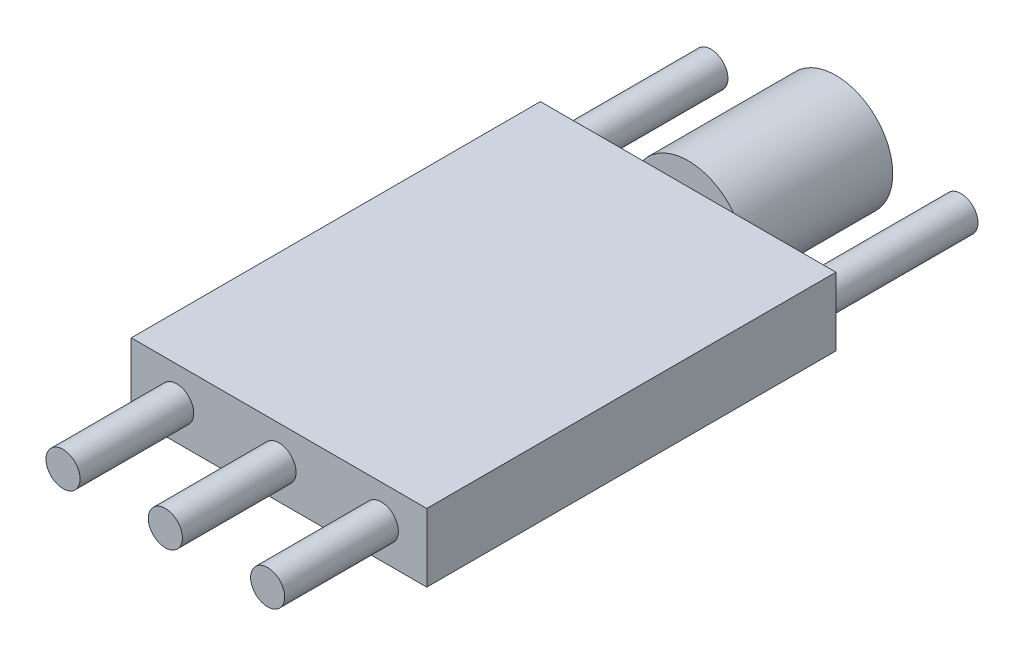
ISO-10303-21;
HEADER;
FILE_DESCRIPTION(('STEP AP214'),'2;1');
FILE_NAME('part.step','',(''),(''),'','','');
FILE_SCHEMA(('AUTOMOTIVE_DESIGN { 1 0 10303 214 1 1 1 1 }'));
ENDSEC;
DATA;
#1=APPLICATION_CONTEXT('core data for automotive mechanical design processes');
#2=APPLICATION_PROTOCOL_DEFINITION('international standard','automotive_design',2000,#1);
#3=PRODUCT_CONTEXT('',#1,'mechanical');
#4=PRODUCT('Part','Part','',(#3));
#5=PRODUCT_RELATED_PRODUCT_CATEGORY('part','',(#4));
#6=PRODUCT_DEFINITION_FORMATION('','',#4);
#7=PRODUCT_DEFINITION_CONTEXT('part definition',#1,'design');
#8=PRODUCT_DEFINITION('design','',#6,#7);
#9=PRODUCT_DEFINITION_SHAPE('','',#8);
#10=(LENGTH_UNIT() NAMED_UNIT(*) SI_UNIT(.MILLI.,.METRE.));
#11=(NAMED_UNIT(*) PLANE_ANGLE_UNIT() SI_UNIT($,.RADIAN.));
#12=(NAMED_UNIT(*) SI_UNIT($,.STERADIAN.) SOLID_ANGLE_UNIT());
#13=UNCERTAINTY_MEASURE_WITH_UNIT(LENGTH_MEASURE(1.E-05),#10,'distance_accuracy_value','');
#14=(GEOMETRIC_REPRESENTATION_CONTEXT(3) GLOBAL_UNCERTAINTY_ASSIGNED_CONTEXT((#13)) GLOBAL_UNIT_ASSIGNED_CONTEXT((#10,
#11,#12)) REPRESENTATION_CONTEXT('',''));
#15=CARTESIAN_POINT('',(0.,0.,0.));
#16=DIRECTION('',(0.,0.,1.));
#17=DIRECTION('',(1.,0.,0.));
#18=AXIS2_PLACEMENT_3D('',#15,#16,#17);
#19=CARTESIAN_POINT('',(-13.,6.,-18.));
#20=DIRECTION('',(0.,0.,1.));
#21=DIRECTION('',(1.,0.,0.));
#22=AXIS2_PLACEMENT_3D('',#19,#20,#21);
#23=PLANE('',#22);
#24=CARTESIAN_POINT('',(11.,3.,-18.));
#25=DIRECTION('',(0.,0.,1.));
#26=DIRECTION('',(1.,0.,0.));
#27=AXIS2_PLACEMENT_3D('',#24,#25,#26);
#28=CIRCLE('',#27,1.5);
#29=CARTESIAN_POINT('',(12.5,3.,-18.));
#30=VERTEX_POINT('',#29);
#31=EDGE_CURVE('E42',#30,#30,#28,.F.);
#32=ORIENTED_EDGE('',*,*,#31,.F.);
#33=EDGE_LOOP('',(#32));
#34=FACE_BOUND('',#33,.T.);
#35=CARTESIAN_POINT('',(0.,3.,-18.));
#36=DIRECTION('',(0.,0.,-1.));
#37=DIRECTION('',(-1.,0.,0.));
#38=AXIS2_PLACEMENT_3D('',#35,#36,#37);
#39=CIRCLE('',#38,5.);
#40=CARTESIAN_POINT('',(4.,6.,-18.));
#41=VERTEX_POINT('',#40);
#42=CARTESIAN_POINT('',(4.,0.,-18.));
#43=VERTEX_POINT('',#42);
#44=EDGE_CURVE('E49',#41,#43,#39,.T.);
#45=ORIENTED_EDGE('',*,*,#44,.F.);
#46=DIRECTION('',(-1.,0.,0.));
#47=VECTOR('',#46,1.);
#48=CARTESIAN_POINT('',(-13.,6.,-18.));
#49=LINE('',#48,#47);
#50=CARTESIAN_POINT('',(13.,6.,-18.));
#51=VERTEX_POINT('',#50);
#52=EDGE_CURVE('E93',#51,#41,#49,.T.);
#53=ORIENTED_EDGE('',*,*,#52,.F.);
#54=DIRECTION('',(0.,-1.,0.));
#55=VECTOR('',#54,1.);
#56=CARTESIAN_POINT('',(13.,6.,-18.));
#57=LINE('',#56,#55);
#58=CARTESIAN_POINT('',(13.,0.,-18.));
#59=VERTEX_POINT('',#58);
#60=EDGE_CURVE('E150',#51,#59,#57,.T.);
#61=ORIENTED_EDGE('',*,*,#60,.T.);
#62=DIRECTION('',(-1.,0.,0.));
#63=VECTOR('',#62,1.);
#64=CARTESIAN_POINT('',(-13.,0.,-18.));
#65=LINE('',#64,#63);
#66=EDGE_CURVE('E138',#59,#43,#65,.T.);
#67=ORIENTED_EDGE('',*,*,#66,.T.);
#68=EDGE_LOOP('',(#45,#53,#61,#67));
#69=FACE_BOUND('',#68,.T.);
#70=ADVANCED_FACE('F34',(#34,#69),#23,.F.);
#71=CARTESIAN_POINT('',(13.,6.,-18.));
#72=DIRECTION('',(-1.,0.,0.));
#73=DIRECTION('',(0.,0.,1.));
#74=AXIS2_PLACEMENT_3D('',#71,#72,#73);
#75=PLANE('',#74);
#76=DIRECTION('',(0.,0.,-1.));
#77=VECTOR('',#76,1.);
#78=CARTESIAN_POINT('',(13.,0.,-18.));
#79=LINE('',#78,#77);
#80=CARTESIAN_POINT('',(13.,0.,18.));
#81=VERTEX_POINT('',#80);
#82=EDGE_CURVE('E127',#81,#59,#79,.T.);
#83=ORIENTED_EDGE('',*,*,#82,.T.);
#84=ORIENTED_EDGE('',*,*,#60,.F.);
#85=DIRECTION('',(0.,0.,-1.));
#86=VECTOR('',#85,1.);
#87=CARTESIAN_POINT('',(13.,6.,-18.));
#88=LINE('',#87,#86);
#89=CARTESIAN_POINT('',(13.,6.,18.));
#90=VERTEX_POINT('',#89);
#91=EDGE_CURVE('E102',#90,#51,#88,.T.);
#92=ORIENTED_EDGE('',*,*,#91,.F.);
#93=DIRECTION('',(0.,-1.,0.));
#94=VECTOR('',#93,1.);
#95=CARTESIAN_POINT('',(13.,6.,18.));
#96=LINE('',#95,#94);
#97=EDGE_CURVE('E134',#90,#81,#96,.T.);
#98=ORIENTED_EDGE('',*,*,#97,.T.);
#99=EDGE_LOOP('',(#83,#84,#92,#98));
#100=FACE_BOUND('',#99,.T.);
#101=ADVANCED_FACE('F36',(#100),#75,.F.);
#102=CARTESIAN_POINT('',(-11.,3.,-18.));
#103=DIRECTION('',(0.,0.,1.));
#104=DIRECTION('',(1.,0.,0.));
#105=AXIS2_PLACEMENT_3D('',#102,#103,#104);
#106=CIRCLE('',#105,1.5);
#107=CARTESIAN_POINT('',(-9.5,3.,-18.));
#108=VERTEX_POINT('',#107);
#109=EDGE_CURVE('E11',#108,#108,#106,.F.);
#110=ORIENTED_EDGE('',*,*,#109,.F.);
#111=EDGE_LOOP('',(#110));
#112=FACE_BOUND('',#111,.T.);
#113=CARTESIAN_POINT('',(-4.,0.,-18.));
#114=VERTEX_POINT('',#113);
#115=CARTESIAN_POINT('',(-4.,6.,-18.));
#116=VERTEX_POINT('',#115);
#117=EDGE_CURVE('E57',#114,#116,#39,.T.);
#118=ORIENTED_EDGE('',*,*,#117,.F.);
#119=CARTESIAN_POINT('',(-13.,0.,-18.));
#120=VERTEX_POINT('',#119);
#121=EDGE_CURVE('E137',#114,#120,#65,.T.);
#122=ORIENTED_EDGE('',*,*,#121,.T.);
#123=DIRECTION('',(0.,-1.,0.));
#124=VECTOR('',#123,1.);
#125=CARTESIAN_POINT('',(-13.,6.,-18.));
#126=LINE('',#125,#124);
#127=CARTESIAN_POINT('',(-13.,6.,-18.));
#128=VERTEX_POINT('',#127);
#129=EDGE_CURVE('E100',#128,#120,#126,.T.);
#130=ORIENTED_EDGE('',*,*,#129,.F.);
#131=EDGE_CURVE('E91',#116,#128,#49,.T.);
#132=ORIENTED_EDGE('',*,*,#131,.F.);
#133=EDGE_LOOP('',(#118,#122,#130,#132));
#134=FACE_BOUND('',#133,.T.);
#135=ADVANCED_FACE('F98',(#112,#134),#23,.F.);
#136=CARTESIAN_POINT('',(-13.,6.,-18.));
#137=DIRECTION('',(1.,0.,0.));
#138=DIRECTION('',(0.,0.,-1.));
#139=AXIS2_PLACEMENT_3D('',#136,#137,#138);
#140=PLANE('',#139);
#141=DIRECTION('',(0.,0.,1.));
#142=VECTOR('',#141,1.);
#143=CARTESIAN_POINT('',(-13.,0.,-18.));
#144=LINE('',#143,#142);
#145=CARTESIAN_POINT('',(-13.,0.,18.));
#146=VERTEX_POINT('',#145);
#147=EDGE_CURVE('E140',#120,#146,#144,.T.);
#148=ORIENTED_EDGE('',*,*,#147,.T.);
#149=DIRECTION('',(0.,-1.,0.));
#150=VECTOR('',#149,1.);
#151=CARTESIAN_POINT('',(-13.,6.,18.));
#152=LINE('',#151,#150);
#153=CARTESIAN_POINT('',(-13.,6.,18.));
#154=VERTEX_POINT('',#153);
#155=EDGE_CURVE('E146',#154,#146,#152,.T.);
#156=ORIENTED_EDGE('',*,*,#155,.F.);
#157=DIRECTION('',(0.,0.,1.));
#158=VECTOR('',#157,1.);
#159=CARTESIAN_POINT('',(-13.,6.,-18.));
#160=LINE('',#159,#158);
#161=EDGE_CURVE('E130',#128,#154,#160,.T.);
#162=ORIENTED_EDGE('',*,*,#161,.F.);
#163=ORIENTED_EDGE('',*,*,#129,.T.);
#164=EDGE_LOOP('',(#148,#156,#162,#163));
#165=FACE_BOUND('',#164,.T.);
#166=ADVANCED_FACE('F172',(#165),#140,.F.);
#167=CARTESIAN_POINT('',(-13.,6.,18.));
#168=DIRECTION('',(0.,0.,-1.));
#169=DIRECTION('',(-1.,0.,0.));
#170=AXIS2_PLACEMENT_3D('',#167,#168,#169);
#171=PLANE('',#170);
#172=CARTESIAN_POINT('',(9.,3.,18.));
#173=DIRECTION('',(0.,0.,-1.));
#174=DIRECTION('',(-1.,0.,0.));
#175=AXIS2_PLACEMENT_3D('',#172,#173,#174);
#176=CIRCLE('',#175,1.5);
#177=CARTESIAN_POINT('',(7.5,3.,18.));
#178=VERTEX_POINT('',#177);
#179=EDGE_CURVE('E109',#178,#178,#176,.F.);
#180=ORIENTED_EDGE('',*,*,#179,.F.);
#181=EDGE_LOOP('',(#180));
#182=FACE_BOUND('',#181,.T.);
#183=CARTESIAN_POINT('',(-9.,3.,18.));
#184=DIRECTION('',(0.,0.,-1.));
#185=DIRECTION('',(-1.,0.,0.));
#186=AXIS2_PLACEMENT_3D('',#183,#184,#185);
#187=CIRCLE('',#186,1.5);
#188=CARTESIAN_POINT('',(-10.5,3.,18.));
#189=VERTEX_POINT('',#188);
#190=EDGE_CURVE('E156',#189,#189,#187,.F.);
#191=ORIENTED_EDGE('',*,*,#190,.F.);
#192=EDGE_LOOP('',(#191));
#193=FACE_BOUND('',#192,.T.);
#194=CARTESIAN_POINT('',(0.,3.,18.));
#195=DIRECTION('',(0.,0.,-1.));
#196=DIRECTION('',(-1.,0.,0.));
#197=AXIS2_PLACEMENT_3D('',#194,#195,#196);
#198=CIRCLE('',#197,1.5);
#199=CARTESIAN_POINT('',(-1.5,3.,18.));
#200=VERTEX_POINT('',#199);
#201=EDGE_CURVE('E153',#200,#200,#198,.F.);
#202=ORIENTED_EDGE('',*,*,#201,.F.);
#203=EDGE_LOOP('',(#202));
#204=FACE_BOUND('',#203,.T.);
#205=DIRECTION('',(1.,0.,0.));
#206=VECTOR('',#205,1.);
#207=CARTESIAN_POINT('',(-13.,0.,18.));
#208=LINE('',#207,#206);
#209=EDGE_CURVE('E128',#146,#81,#208,.T.);
#210=ORIENTED_EDGE('',*,*,#209,.T.);
#211=ORIENTED_EDGE('',*,*,#97,.F.);
#212=DIRECTION('',(1.,0.,0.));
#213=VECTOR('',#212,1.);
#214=CARTESIAN_POINT('',(-13.,6.,18.));
#215=LINE('',#214,#213);
#216=EDGE_CURVE('E132',#154,#90,#215,.T.);
#217=ORIENTED_EDGE('',*,*,#216,.F.);
#218=ORIENTED_EDGE('',*,*,#155,.T.);
#219=EDGE_LOOP('',(#210,#211,#217,#218));
#220=FACE_BOUND('',#219,.T.);
#221=ADVANCED_FACE('F177',(#182,#193,#204,#220),#171,.F.);
#222=CARTESIAN_POINT('',(0.,6.,0.));
#223=DIRECTION('',(0.,1.,0.));
#224=DIRECTION('',(0.,0.,1.));
#225=AXIS2_PLACEMENT_3D('',#222,#223,#224);
#226=PLANE('',#225);
#227=ORIENTED_EDGE('',*,*,#91,.T.);
#228=ORIENTED_EDGE('',*,*,#52,.T.);
#229=EDGE_CURVE('E88',#41,#116,#49,.T.);
#230=ORIENTED_EDGE('',*,*,#229,.T.);
#231=ORIENTED_EDGE('',*,*,#131,.T.);
#232=ORIENTED_EDGE('',*,*,#161,.T.);
#233=ORIENTED_EDGE('',*,*,#216,.T.);
#234=EDGE_LOOP('',(#227,#228,#230,#231,#232,#233));
#235=FACE_BOUND('',#234,.T.);
#236=ADVANCED_FACE('F90',(#235),#226,.T.);
#237=CARTESIAN_POINT('',(0.,0.,0.));
#238=DIRECTION('',(0.,1.,0.));
#239=DIRECTION('',(0.,0.,1.));
#240=AXIS2_PLACEMENT_3D('',#237,#238,#239);
#241=PLANE('',#240);
#242=ORIENTED_EDGE('',*,*,#82,.F.);
#243=ORIENTED_EDGE('',*,*,#209,.F.);
#244=ORIENTED_EDGE('',*,*,#147,.F.);
#245=ORIENTED_EDGE('',*,*,#121,.F.);
#246=EDGE_CURVE('E141',#43,#114,#65,.T.);
#247=ORIENTED_EDGE('',*,*,#246,.F.);
#248=ORIENTED_EDGE('',*,*,#66,.F.);
#249=EDGE_LOOP('',(#242,#243,#244,#245,#247,#248));
#250=FACE_BOUND('',#249,.T.);
#251=ADVANCED_FACE('F233',(#250),#241,.F.);
#252=CARTESIAN_POINT('',(0.,3.,28.));
#253=DIRECTION('',(0.,0.,-1.));
#254=DIRECTION('',(-1.,0.,0.));
#255=AXIS2_PLACEMENT_3D('',#252,#253,#254);
#256=CYLINDRICAL_SURFACE('',#255,1.5);
#257=CARTESIAN_POINT('',(0.,3.,28.));
#258=DIRECTION('',(0.,0.,1.));
#259=DIRECTION('',(1.,0.,0.));
#260=AXIS2_PLACEMENT_3D('',#257,#258,#259);
#261=CIRCLE('',#260,1.5);
#262=CARTESIAN_POINT('',(1.5,3.,28.));
#263=VERTEX_POINT('',#262);
#264=EDGE_CURVE('E124',#263,#263,#261,.T.);
#265=ORIENTED_EDGE('',*,*,#264,.F.);
#266=EDGE_LOOP('',(#265));
#267=FACE_BOUND('',#266,.T.);
#268=ORIENTED_EDGE('',*,*,#201,.T.);
#269=EDGE_LOOP('',(#268));
#270=FACE_BOUND('',#269,.T.);
#271=ADVANCED_FACE('F229',(#267,#270),#256,.T.);
#272=CARTESIAN_POINT('',(0.,3.,28.));
#273=DIRECTION('',(0.,0.,1.));
#274=DIRECTION('',(1.,0.,0.));
#275=AXIS2_PLACEMENT_3D('',#272,#273,#274);
#276=PLANE('',#275);
#277=ORIENTED_EDGE('',*,*,#264,.T.);
#278=EDGE_LOOP('',(#277));
#279=FACE_BOUND('',#278,.T.);
#280=ADVANCED_FACE('F225',(#279),#276,.T.);
#281=CARTESIAN_POINT('',(-9.,3.,28.));
#282=DIRECTION('',(0.,0.,-1.));
#283=DIRECTION('',(-1.,0.,0.));
#284=AXIS2_PLACEMENT_3D('',#281,#282,#283);
#285=CYLINDRICAL_SURFACE('',#284,1.5);
#286=CARTESIAN_POINT('',(-9.,3.,28.));
#287=DIRECTION('',(0.,0.,1.));
#288=DIRECTION('',(1.,0.,0.));
#289=AXIS2_PLACEMENT_3D('',#286,#287,#288);
#290=CIRCLE('',#289,1.5);
#291=CARTESIAN_POINT('',(-7.5,3.,28.));
#292=VERTEX_POINT('',#291);
#293=EDGE_CURVE('E121',#292,#292,#290,.T.);
#294=ORIENTED_EDGE('',*,*,#293,.F.);
#295=EDGE_LOOP('',(#294));
#296=FACE_BOUND('',#295,.T.);
#297=ORIENTED_EDGE('',*,*,#190,.T.);
#298=EDGE_LOOP('',(#297));
#299=FACE_BOUND('',#298,.T.);
#300=ADVANCED_FACE('F221',(#296,#299),#285,.T.);
#301=CARTESIAN_POINT('',(-9.,3.,28.));
#302=DIRECTION('',(0.,0.,1.));
#303=DIRECTION('',(1.,0.,0.));
#304=AXIS2_PLACEMENT_3D('',#301,#302,#303);
#305=PLANE('',#304);
#306=ORIENTED_EDGE('',*,*,#293,.T.);
#307=EDGE_LOOP('',(#306));
#308=FACE_BOUND('',#307,.T.);
#309=ADVANCED_FACE('F217',(#308),#305,.T.);
#310=CARTESIAN_POINT('',(9.,3.,28.));
#311=DIRECTION('',(0.,0.,-1.));
#312=DIRECTION('',(-1.,0.,0.));
#313=AXIS2_PLACEMENT_3D('',#310,#311,#312);
#314=CYLINDRICAL_SURFACE('',#313,1.5);
#315=CARTESIAN_POINT('',(9.,3.,28.));
#316=DIRECTION('',(0.,0.,1.));
#317=DIRECTION('',(1.,0.,0.));
#318=AXIS2_PLACEMENT_3D('',#315,#316,#317);
#319=CIRCLE('',#318,1.5);
#320=CARTESIAN_POINT('',(10.5,3.,28.));
#321=VERTEX_POINT('',#320);
#322=EDGE_CURVE('E114',#321,#321,#319,.T.);
#323=ORIENTED_EDGE('',*,*,#322,.F.);
#324=EDGE_LOOP('',(#323));
#325=FACE_BOUND('',#324,.T.);
#326=ORIENTED_EDGE('',*,*,#179,.T.);
#327=EDGE_LOOP('',(#326));
#328=FACE_BOUND('',#327,.T.);
#329=ADVANCED_FACE('F213',(#325,#328),#314,.T.);
#330=CARTESIAN_POINT('',(9.,3.,28.));
#331=DIRECTION('',(0.,0.,1.));
#332=DIRECTION('',(1.,0.,0.));
#333=AXIS2_PLACEMENT_3D('',#330,#331,#332);
#334=PLANE('',#333);
#335=ORIENTED_EDGE('',*,*,#322,.T.);
#336=EDGE_LOOP('',(#335));
#337=FACE_BOUND('',#336,.T.);
#338=ADVANCED_FACE('F210',(#337),#334,.T.);
#339=CARTESIAN_POINT('',(0.,3.,-18.));
#340=DIRECTION('',(0.,0.,-1.));
#341=DIRECTION('',(-1.,0.,0.));
#342=AXIS2_PLACEMENT_3D('',#339,#340,#341);
#343=PLANE('',#342);
#344=EDGE_CURVE('E108',#43,#114,#39,.T.);
#345=ORIENTED_EDGE('',*,*,#344,.F.);
#346=ORIENTED_EDGE('',*,*,#246,.T.);
#347=EDGE_LOOP('',(#345,#346));
#348=FACE_BOUND('',#347,.T.);
#349=ADVANCED_FACE('F206',(#348),#343,.F.);
#350=CARTESIAN_POINT('',(0.,3.,-31.));
#351=DIRECTION('',(0.,0.,1.));
#352=DIRECTION('',(1.,0.,0.));
#353=AXIS2_PLACEMENT_3D('',#350,#351,#352);
#354=CYLINDRICAL_SURFACE('',#353,5.);
#355=CARTESIAN_POINT('',(0.,3.,-31.));
#356=DIRECTION('',(0.,0.,-1.));
#357=DIRECTION('',(-1.,0.,0.));
#358=AXIS2_PLACEMENT_3D('',#355,#356,#357);
#359=CIRCLE('',#358,5.);
#360=CARTESIAN_POINT('',(-5.,3.,-31.));
#361=VERTEX_POINT('',#360);
#362=EDGE_CURVE('E112',#361,#361,#359,.T.);
#363=ORIENTED_EDGE('',*,*,#362,.F.);
#364=EDGE_LOOP('',(#363));
#365=FACE_BOUND('',#364,.T.);
#366=EDGE_CURVE('E106',#116,#41,#39,.T.);
#367=ORIENTED_EDGE('',*,*,#366,.T.);
#368=ORIENTED_EDGE('',*,*,#44,.T.);
#369=ORIENTED_EDGE('',*,*,#344,.T.);
#370=ORIENTED_EDGE('',*,*,#117,.T.);
#371=EDGE_LOOP('',(#367,#368,#369,#370));
#372=FACE_BOUND('',#371,.T.);
#373=ADVANCED_FACE('F105',(#365,#372),#354,.T.);
#374=CARTESIAN_POINT('',(0.,3.,-31.));
#375=DIRECTION('',(0.,0.,-1.));
#376=DIRECTION('',(-1.,0.,0.));
#377=AXIS2_PLACEMENT_3D('',#374,#375,#376);
#378=PLANE('',#377);
#379=ORIENTED_EDGE('',*,*,#362,.T.);
#380=EDGE_LOOP('',(#379));
#381=FACE_BOUND('',#380,.T.);
#382=ADVANCED_FACE('F200',(#381),#378,.T.);
#383=ORIENTED_EDGE('',*,*,#229,.F.);
#384=ORIENTED_EDGE('',*,*,#366,.F.);
#385=EDGE_LOOP('',(#383,#384));
#386=FACE_BOUND('',#385,.T.);
#387=ADVANCED_FACE('F111',(#386),#343,.F.);
#388=CARTESIAN_POINT('',(11.,3.,-31.));
#389=DIRECTION('',(0.,0.,1.));
#390=DIRECTION('',(1.,0.,0.));
#391=AXIS2_PLACEMENT_3D('',#388,#389,#390);
#392=CYLINDRICAL_SURFACE('',#391,1.5);
#393=CARTESIAN_POINT('',(11.,3.,-31.));
#394=DIRECTION('',(0.,0.,-1.));
#395=DIRECTION('',(-1.,0.,0.));
#396=AXIS2_PLACEMENT_3D('',#393,#394,#395);
#397=CIRCLE('',#396,1.5);
#398=CARTESIAN_POINT('',(12.5,3.,-31.));
#399=VERTEX_POINT('',#398);
#400=EDGE_CURVE('E116',#399,#399,#397,.T.);
#401=CARTESIAN_POINT('',(12.5,3.,-31.));
#402=CARTESIAN_POINT('',(12.5,3.,-30.8645833333333));
#403=CARTESIAN_POINT('',(12.5,3.,-30.7291666666667));
#404=CARTESIAN_POINT('',(12.5,3.,-30.4583333333333));
#405=CARTESIAN_POINT('',(12.5,3.,-30.3229166666667));
#406=CARTESIAN_POINT('',(12.5,3.,-30.0520833333333));
#407=CARTESIAN_POINT('',(12.5,3.,-29.9166666666667));
#408=CARTESIAN_POINT('',(12.5,3.,-29.6458333333333));
#409=CARTESIAN_POINT('',(12.5,3.,-29.5104166666667));
#410=CARTESIAN_POINT('',(12.5,3.,-29.2395833333333));
#411=CARTESIAN_POINT('',(12.5,3.,-29.1041666666667));
#412=CARTESIAN_POINT('',(12.5,3.,-28.8333333333333));
#413=CARTESIAN_POINT('',(12.5,3.,-28.6979166666667));
#414=CARTESIAN_POINT('',(12.5,3.,-28.4270833333333));
#415=CARTESIAN_POINT('',(12.5,3.,-28.2916666666667));
#416=CARTESIAN_POINT('',(12.5,3.,-28.0208333333333));
#417=CARTESIAN_POINT('',(12.5,3.,-27.8854166666667));
#418=CARTESIAN_POINT('',(12.5,3.,-27.6145833333333));
#419=CARTESIAN_POINT('',(12.5,3.,-27.4791666666667));
#420=CARTESIAN_POINT('',(12.5,3.,-27.2083333333333));
#421=CARTESIAN_POINT('',(12.5,3.,-27.0729166666667));
#422=CARTESIAN_POINT('',(12.5,3.,-26.8020833333333));
#423=CARTESIAN_POINT('',(12.5,3.,-26.6666666666667));
#424=CARTESIAN_POINT('',(12.5,3.,-26.3958333333333));
#425=CARTESIAN_POINT('',(12.5,3.,-26.2604166666667));
#426=CARTESIAN_POINT('',(12.5,3.,-25.9895833333333));
#427=CARTESIAN_POINT('',(12.5,3.,-25.8541666666667));
#428=CARTESIAN_POINT('',(12.5,3.,-25.5833333333333));
#429=CARTESIAN_POINT('',(12.5,3.,-25.4479166666667));
#430=CARTESIAN_POINT('',(12.5,3.,-25.1770833333333));
#431=CARTESIAN_POINT('',(12.5,3.,-25.0416666666667));
#432=CARTESIAN_POINT('',(12.5,3.,-24.7708333333333));
#433=CARTESIAN_POINT('',(12.5,3.,-24.6354166666667));
#434=CARTESIAN_POINT('',(12.5,3.,-24.3645833333333));
#435=CARTESIAN_POINT('',(12.5,3.,-24.2291666666667));
#436=CARTESIAN_POINT('',(12.5,3.,-23.9583333333333));
#437=CARTESIAN_POINT('',(12.5,3.,-23.8229166666667));
#438=CARTESIAN_POINT('',(12.5,3.,-23.5520833333333));
#439=CARTESIAN_POINT('',(12.5,3.,-23.4166666666667));
#440=CARTESIAN_POINT('',(12.5,3.,-23.1458333333333));
#441=CARTESIAN_POINT('',(12.5,3.,-23.0104166666667));
#442=CARTESIAN_POINT('',(12.5,3.,-22.7395833333333));
#443=CARTESIAN_POINT('',(12.5,3.,-22.6041666666667));
#444=CARTESIAN_POINT('',(12.5,3.,-22.3333333333333));
#445=CARTESIAN_POINT('',(12.5,3.,-22.1979166666667));
#446=CARTESIAN_POINT('',(12.5,3.,-21.9270833333333));
#447=CARTESIAN_POINT('',(12.5,3.,-21.7916666666667));
#448=CARTESIAN_POINT('',(12.5,3.,-21.5208333333333));
#449=CARTESIAN_POINT('',(12.5,3.,-21.3854166666667));
#450=CARTESIAN_POINT('',(12.5,3.,-21.1145833333333));
#451=CARTESIAN_POINT('',(12.5,3.,-20.9791666666667));
#452=CARTESIAN_POINT('',(12.5,3.,-20.7083333333333));
#453=CARTESIAN_POINT('',(12.5,3.,-20.5729166666667));
#454=CARTESIAN_POINT('',(12.5,3.,-20.3020833333333));
#455=CARTESIAN_POINT('',(12.5,3.,-20.1666666666667));
#456=CARTESIAN_POINT('',(12.5,3.,-19.8958333333333));
#457=CARTESIAN_POINT('',(12.5,3.,-19.7604166666667));
#458=CARTESIAN_POINT('',(12.5,3.,-19.4895833333333));
#459=CARTESIAN_POINT('',(12.5,3.,-19.3541666666667));
#460=CARTESIAN_POINT('',(12.5,3.,-19.0833333333333));
#461=CARTESIAN_POINT('',(12.5,3.,-18.9479166666667));
#462=CARTESIAN_POINT('',(12.5,3.,-18.6770833333333));
#463=CARTESIAN_POINT('',(12.5,3.,-18.5416666666667));
#464=CARTESIAN_POINT('',(12.5,3.,-18.2708333333333));
#465=CARTESIAN_POINT('',(12.5,3.,-18.1354166666667));
#466=CARTESIAN_POINT('',(12.5,3.,-18.));
#467=B_SPLINE_CURVE_WITH_KNOTS('',3,(#401,#402,#403,#404,#405,#406,#407,#408,#409,#410,#411,
#412,#413,#414,#415,#416,#417,#418,#419,#420,#421,#422,#423,#424,#425,#426,#427,#428,#429,#430,
#431,#432,#433,#434,#435,#436,#437,#438,#439,#440,#441,#442,#443,#444,#445,#446,#447,#448,#449,
#450,#451,#452,#453,#454,#455,#456,#457,#458,#459,#460,#461,#462,#463,#464,#465,#466),
.UNSPECIFIED.,.F.,.F.,(4,2,2,2,2,2,2,2,2,2,2,2,2,2,2,2,2,2,2,2,2,2,2,2,2,2,2,2,2,2,2,2,4),(0.,
0.406249999999997,0.812499999999997,1.21875,1.625,2.03125,2.4375,2.84375,3.25,3.65625,4.0625,
4.46875,4.87499999999999,5.28125,5.68749999999999,6.09374999999999,6.5,6.90625,7.3125,
7.71874999999999,8.12499999999999,8.53124999999999,8.93749999999999,9.34374999999999,
9.74999999999999,10.15625,10.5625,10.96875,11.375,11.78125,12.1875,12.59375,13.),.UNSPECIFIED.);
#468=EDGE_CURVE('BSEAM163',#399,#30,#467,.T.);
#469=ORIENTED_EDGE('',*,*,#400,.F.);
#470=ORIENTED_EDGE('',*,*,#31,.T.);
#471=ORIENTED_EDGE('',*,*,#468,.T.);
#472=ORIENTED_EDGE('',*,*,#468,.F.);
#473=EDGE_LOOP('',(#469,#471,#470,#472));
#474=FACE_BOUND('',#473,.T.);
#475=ADVANCED_FACE('F163',(#474),#392,.T.);
#476=CARTESIAN_POINT('',(11.,3.,-31.));
#477=DIRECTION('',(0.,0.,-1.));
#478=DIRECTION('',(-1.,0.,0.));
#479=AXIS2_PLACEMENT_3D('',#476,#477,#478);
#480=PLANE('',#479);
#481=ORIENTED_EDGE('',*,*,#400,.T.);
#482=EDGE_LOOP('',(#481));
#483=FACE_BOUND('',#482,.T.);
#484=ADVANCED_FACE('F184',(#483),#480,.T.);
#485=CARTESIAN_POINT('',(-11.,3.,-31.));
#486=DIRECTION('',(0.,0.,1.));
#487=DIRECTION('',(1.,0.,0.));
#488=AXIS2_PLACEMENT_3D('',#485,#486,#487);
#489=CYLINDRICAL_SURFACE('',#488,1.5);
#490=CARTESIAN_POINT('',(-11.,3.,-31.));
#491=DIRECTION('',(0.,0.,-1.));
#492=DIRECTION('',(-1.,0.,0.));
#493=AXIS2_PLACEMENT_3D('',#490,#491,#492);
#494=CIRCLE('',#493,1.5);
#495=CARTESIAN_POINT('',(-9.5,3.,-31.));
#496=VERTEX_POINT('',#495);
#497=EDGE_CURVE('E414',#496,#496,#494,.T.);
#498=CARTESIAN_POINT('',(-9.5,3.,-31.));
#499=CARTESIAN_POINT('',(-9.5,3.,-30.8645833333333));
#500=CARTESIAN_POINT('',(-9.5,3.,-30.7291666666667));
#501=CARTESIAN_POINT('',(-9.5,3.,-30.4583333333333));
#502=CARTESIAN_POINT('',(-9.5,3.,-30.3229166666667));
#503=CARTESIAN_POINT('',(-9.5,3.,-30.0520833333333));
#504=CARTESIAN_POINT('',(-9.5,3.,-29.9166666666667));
#505=CARTESIAN_POINT('',(-9.5,3.,-29.6458333333333));
#506=CARTESIAN_POINT('',(-9.5,3.,-29.5104166666667));
#507=CARTESIAN_POINT('',(-9.5,3.,-29.2395833333333));
#508=CARTESIAN_POINT('',(-9.5,3.,-29.1041666666667));
#509=CARTESIAN_POINT('',(-9.5,3.,-28.8333333333333));
#510=CARTESIAN_POINT('',(-9.5,3.,-28.6979166666667));
#511=CARTESIAN_POINT('',(-9.5,3.,-28.4270833333333));
#512=CARTESIAN_POINT('',(-9.5,3.,-28.2916666666667));
#513=CARTESIAN_POINT('',(-9.5,3.,-28.0208333333333));
#514=CARTESIAN_POINT('',(-9.5,3.,-27.8854166666667));
#515=CARTESIAN_POINT('',(-9.5,3.,-27.6145833333333));
#516=CARTESIAN_POINT('',(-9.5,3.,-27.4791666666667));
#517=CARTESIAN_POINT('',(-9.5,3.,-27.2083333333333));
#518=CARTESIAN_POINT('',(-9.5,3.,-27.0729166666667));
#519=CARTESIAN_POINT('',(-9.5,3.,-26.8020833333333));
#520=CARTESIAN_POINT('',(-9.5,3.,-26.6666666666667));
#521=CARTESIAN_POINT('',(-9.5,3.,-26.3958333333333));
#522=CARTESIAN_POINT('',(-9.5,3.,-26.2604166666667));
#523=CARTESIAN_POINT('',(-9.5,3.,-25.9895833333333));
#524=CARTESIAN_POINT('',(-9.5,3.,-25.8541666666667));
#525=CARTESIAN_POINT('',(-9.5,3.,-25.5833333333333));
#526=CARTESIAN_POINT('',(-9.5,3.,-25.4479166666667));
#527=CARTESIAN_POINT('',(-9.5,3.,-25.1770833333333));
#528=CARTESIAN_POINT('',(-9.5,3.,-25.0416666666667));
#529=CARTESIAN_POINT('',(-9.5,3.,-24.7708333333333));
#530=CARTESIAN_POINT('',(-9.5,3.,-24.6354166666667));
#531=CARTESIAN_POINT('',(-9.5,3.,-24.3645833333333));
#532=CARTESIAN_POINT('',(-9.5,3.,-24.2291666666667));
#533=CARTESIAN_POINT('',(-9.5,3.,-23.9583333333333));
#534=CARTESIAN_POINT('',(-9.5,3.,-23.8229166666667));
#535=CARTESIAN_POINT('',(-9.5,3.,-23.5520833333333));
#536=CARTESIAN_POINT('',(-9.5,3.,-23.4166666666667));
#537=CARTESIAN_POINT('',(-9.5,3.,-23.1458333333333));
#538=CARTESIAN_POINT('',(-9.5,3.,-23.0104166666667));
#539=CARTESIAN_POINT('',(-9.5,3.,-22.7395833333333));
#540=CARTESIAN_POINT('',(-9.5,3.,-22.6041666666667));
#541=CARTESIAN_POINT('',(-9.5,3.,-22.3333333333333));
#542=CARTESIAN_POINT('',(-9.5,3.,-22.1979166666667));
#543=CARTESIAN_POINT('',(-9.5,3.,-21.9270833333333));
#544=CARTESIAN_POINT('',(-9.5,3.,-21.7916666666667));
#545=CARTESIAN_POINT('',(-9.5,3.,-21.5208333333333));
#546=CARTESIAN_POINT('',(-9.5,3.,-21.3854166666667));
#547=CARTESIAN_POINT('',(-9.5,3.,-21.1145833333333));
#548=CARTESIAN_POINT('',(-9.5,3.,-20.9791666666667));
#549=CARTESIAN_POINT('',(-9.5,3.,-20.7083333333333));
#550=CARTESIAN_POINT('',(-9.5,3.,-20.5729166666667));
#551=CARTESIAN_POINT('',(-9.5,3.,-20.3020833333333));
#552=CARTESIAN_POINT('',(-9.5,3.,-20.1666666666667));
#553=CARTESIAN_POINT('',(-9.5,3.,-19.8958333333333));
#554=CARTESIAN_POINT('',(-9.5,3.,-19.7604166666667));
#555=CARTESIAN_POINT('',(-9.5,3.,-19.4895833333333));
#556=CARTESIAN_POINT('',(-9.5,3.,-19.3541666666667));
#557=CARTESIAN_POINT('',(-9.5,3.,-19.0833333333333));
#558=CARTESIAN_POINT('',(-9.5,3.,-18.9479166666667));
#559=CARTESIAN_POINT('',(-9.5,3.,-18.6770833333333));
#560=CARTESIAN_POINT('',(-9.5,3.,-18.5416666666667));
#561=CARTESIAN_POINT('',(-9.5,3.,-18.2708333333333));
#562=CARTESIAN_POINT('',(-9.5,3.,-18.1354166666667));
#563=CARTESIAN_POINT('',(-9.5,3.,-18.));
#564=B_SPLINE_CURVE_WITH_KNOTS('',3,(#498,#499,#500,#501,#502,#503,#504,#505,#506,#507,#508,
#509,#510,#511,#512,#513,#514,#515,#516,#517,#518,#519,#520,#521,#522,#523,#524,#525,#526,#527,
#528,#529,#530,#531,#532,#533,#534,#535,#536,#537,#538,#539,#540,#541,#542,#543,#544,#545,#546,
#547,#548,#549,#550,#551,#552,#553,#554,#555,#556,#557,#558,#559,#560,#561,#562,#563),
.UNSPECIFIED.,.F.,.F.,(4,2,2,2,2,2,2,2,2,2,2,2,2,2,2,2,2,2,2,2,2,2,2,2,2,2,2,2,2,2,2,2,4),(0.,
0.406249999999997,0.812499999999997,1.21875,1.625,2.03125,2.4375,2.84375,3.25,3.65625,4.0625,
4.46875,4.87499999999999,5.28125,5.68749999999999,6.09374999999999,6.5,6.90625,7.3125,
7.71874999999999,8.12499999999999,8.53124999999999,8.93749999999999,9.34374999999999,
9.74999999999999,10.15625,10.5625,10.96875,11.375,11.78125,12.1875,12.59375,13.),.UNSPECIFIED.);
#565=EDGE_CURVE('BSEAM181',#496,#108,#564,.T.);
#566=ORIENTED_EDGE('',*,*,#497,.F.);
#567=ORIENTED_EDGE('',*,*,#109,.T.);
#568=ORIENTED_EDGE('',*,*,#565,.T.);
#569=ORIENTED_EDGE('',*,*,#565,.F.);
#570=EDGE_LOOP('',(#566,#568,#567,#569));
#571=FACE_BOUND('',#570,.T.);
#572=ADVANCED_FACE('F181',(#571),#489,.T.);
#573=CARTESIAN_POINT('',(-11.,3.,-31.));
#574=DIRECTION('',(0.,0.,-1.));
#575=DIRECTION('',(-1.,0.,0.));
#576=AXIS2_PLACEMENT_3D('',#573,#574,#575);
#577=PLANE('',#576);
#578=ORIENTED_EDGE('',*,*,#497,.T.);
#579=EDGE_LOOP('',(#578));
#580=FACE_BOUND('',#579,.T.);
#581=ADVANCED_FACE('F183',(#580),#577,.T.);
#582=CLOSED_SHELL('',(#70,#101,#135,#166,#221,#236,#251,#271,#280,#300,#309,#329,#338,#349,#373,
#382,#387,#475,#484,#572,#581));
#583=MANIFOLD_SOLID_BREP('B2',#582);
#584=ADVANCED_BREP_SHAPE_REPRESENTATION('',(#18,#583),#14);
#585=SHAPE_DEFINITION_REPRESENTATION(#9,#584);
ENDSEC;
END-ISO-10303-21;
